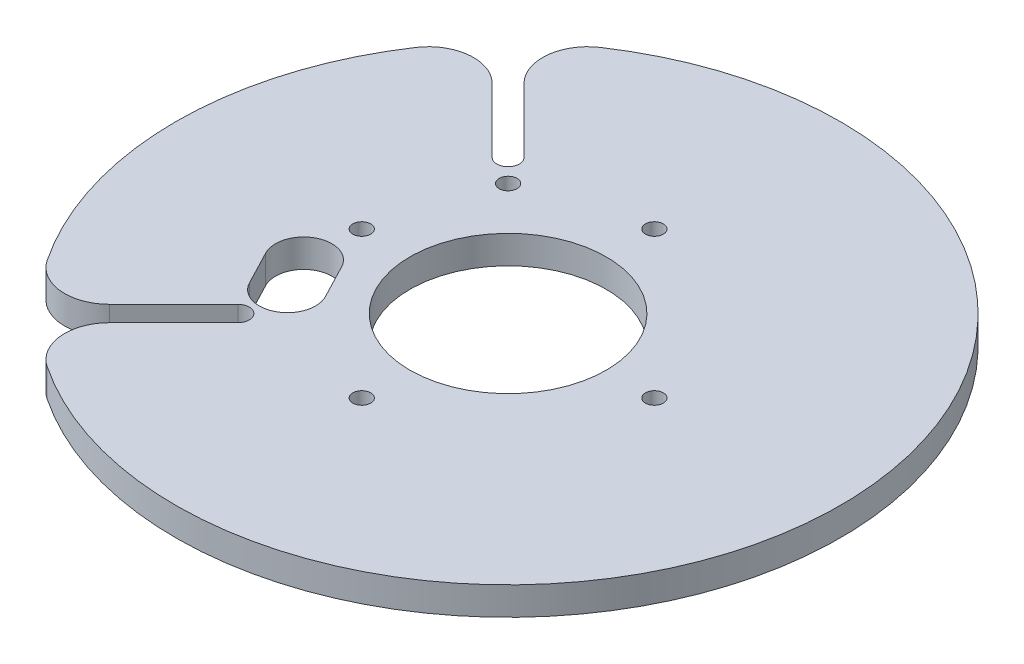
ISO-10303-21;
HEADER;
FILE_DESCRIPTION(('STEP AP214'),'2;1');
FILE_NAME('part.step','',(''),(''),'','','');
FILE_SCHEMA(('AUTOMOTIVE_DESIGN { 1 0 10303 214 1 1 1 1 }'));
ENDSEC;
DATA;
#1=APPLICATION_CONTEXT('core data for automotive mechanical design processes');
#2=APPLICATION_PROTOCOL_DEFINITION('international standard','automotive_design',2000,#1);
#3=PRODUCT_CONTEXT('',#1,'mechanical');
#4=PRODUCT('Part','Part','',(#3));
#5=PRODUCT_RELATED_PRODUCT_CATEGORY('part','',(#4));
#6=PRODUCT_DEFINITION_FORMATION('','',#4);
#7=PRODUCT_DEFINITION_CONTEXT('part definition',#1,'design');
#8=PRODUCT_DEFINITION('design','',#6,#7);
#9=PRODUCT_DEFINITION_SHAPE('','',#8);
#10=(LENGTH_UNIT() NAMED_UNIT(*) SI_UNIT(.MILLI.,.METRE.));
#11=(NAMED_UNIT(*) PLANE_ANGLE_UNIT() SI_UNIT($,.RADIAN.));
#12=(NAMED_UNIT(*) SI_UNIT($,.STERADIAN.) SOLID_ANGLE_UNIT());
#13=UNCERTAINTY_MEASURE_WITH_UNIT(LENGTH_MEASURE(1.E-05),#10,'distance_accuracy_value','');
#14=(GEOMETRIC_REPRESENTATION_CONTEXT(3) GLOBAL_UNCERTAINTY_ASSIGNED_CONTEXT((#13)) GLOBAL_UNIT_ASSIGNED_CONTEXT((#10,
#11,#12)) REPRESENTATION_CONTEXT('',''));
#15=CARTESIAN_POINT('',(0.,0.,0.));
#16=DIRECTION('',(0.,0.,1.));
#17=DIRECTION('',(1.,0.,0.));
#18=AXIS2_PLACEMENT_3D('',#15,#16,#17);
#19=CARTESIAN_POINT('',(0.,6.35,0.));
#20=DIRECTION('',(0.,-1.,0.));
#21=DIRECTION('',(0.,0.,-1.));
#22=AXIS2_PLACEMENT_3D('',#19,#20,#21);
#23=CYLINDRICAL_SURFACE('',#22,75.);
#24=CARTESIAN_POINT('',(0.,6.35,0.));
#25=DIRECTION('',(0.,1.,0.));
#26=DIRECTION('',(0.,0.,1.));
#27=AXIS2_PLACEMENT_3D('',#24,#25,#26);
#28=CIRCLE('',#27,75.);
#29=CARTESIAN_POINT('',(-41.6183838096096,6.35,62.3931897651982));
#30=VERTEX_POINT('',#29);
#31=CARTESIAN_POINT('',(-41.6183838096095,6.35,-62.3931897651982));
#32=VERTEX_POINT('',#31);
#33=EDGE_CURVE('E270',#30,#32,#28,.T.);
#34=ORIENTED_EDGE('',*,*,#33,.F.);
#35=DIRECTION('',(0.,-1.,0.));
#36=VECTOR('',#35,1.);
#37=CARTESIAN_POINT('',(-41.6183838096096,6.35,62.3931897651982));
#38=LINE('',#37,#36);
#39=CARTESIAN_POINT('',(-41.6183838096096,0.,62.3931897651982));
#40=VERTEX_POINT('',#39);
#41=EDGE_CURVE('E279',#30,#40,#38,.T.);
#42=ORIENTED_EDGE('',*,*,#41,.T.);
#43=CARTESIAN_POINT('',(0.,0.,0.));
#44=DIRECTION('',(0.,1.,0.));
#45=DIRECTION('',(0.,0.,1.));
#46=AXIS2_PLACEMENT_3D('',#43,#44,#45);
#47=CIRCLE('',#46,75.);
#48=CARTESIAN_POINT('',(-41.6183838096095,0.,-62.3931897651982));
#49=VERTEX_POINT('',#48);
#50=EDGE_CURVE('E264',#40,#49,#47,.T.);
#51=ORIENTED_EDGE('',*,*,#50,.T.);
#52=DIRECTION('',(0.,-1.,0.));
#53=VECTOR('',#52,1.);
#54=CARTESIAN_POINT('',(-41.6183838096095,6.35,-62.3931897651982));
#55=LINE('',#54,#53);
#56=EDGE_CURVE('E276',#49,#32,#55,.F.);
#57=ORIENTED_EDGE('',*,*,#56,.T.);
#58=EDGE_LOOP('',(#34,#42,#51,#57));
#59=FACE_BOUND('',#58,.T.);
#60=ADVANCED_FACE('F35',(#59),#23,.T.);
#61=CARTESIAN_POINT('',(-62.3931897651982,0.,-41.6183838096095));
#62=VERTEX_POINT('',#61);
#63=CARTESIAN_POINT('',(-62.3931897651983,0.,41.6183838096094));
#64=VERTEX_POINT('',#63);
#65=EDGE_CURVE('E271',#62,#64,#47,.T.);
#66=ORIENTED_EDGE('',*,*,#65,.T.);
#67=DIRECTION('',(0.,-1.,0.));
#68=VECTOR('',#67,1.);
#69=CARTESIAN_POINT('',(-62.3931897651983,6.35,41.6183838096094));
#70=LINE('',#69,#68);
#71=CARTESIAN_POINT('',(-62.3931897651983,6.35,41.6183838096094));
#72=VERTEX_POINT('',#71);
#73=EDGE_CURVE('E302',#64,#72,#70,.F.);
#74=ORIENTED_EDGE('',*,*,#73,.T.);
#75=CARTESIAN_POINT('',(-62.3931897651982,6.35,-41.6183838096095));
#76=VERTEX_POINT('',#75);
#77=EDGE_CURVE('E267',#76,#72,#28,.T.);
#78=ORIENTED_EDGE('',*,*,#77,.F.);
#79=DIRECTION('',(0.,-1.,0.));
#80=VECTOR('',#79,1.);
#81=CARTESIAN_POINT('',(-62.3931897651982,6.35,-41.6183838096095));
#82=LINE('',#81,#80);
#83=EDGE_CURVE('E299',#76,#62,#82,.T.);
#84=ORIENTED_EDGE('',*,*,#83,.T.);
#85=EDGE_LOOP('',(#66,#74,#78,#84));
#86=FACE_BOUND('',#85,.T.);
#87=ADVANCED_FACE('F331',(#86),#23,.T.);
#88=CARTESIAN_POINT('',(0.,6.35,0.));
#89=DIRECTION('',(0.,1.,0.));
#90=DIRECTION('',(0.,0.,1.));
#91=AXIS2_PLACEMENT_3D('',#88,#89,#90);
#92=PLANE('',#91);
#93=CARTESIAN_POINT('',(-33.02,6.35,0.));
#94=DIRECTION('',(0.,1.,0.));
#95=DIRECTION('',(0.,0.,1.));
#96=AXIS2_PLACEMENT_3D('',#93,#94,#95);
#97=CIRCLE('',#96,2.0193);
#98=CARTESIAN_POINT('',(-33.02,6.35,2.0193));
#99=VERTEX_POINT('',#98);
#100=EDGE_CURVE('E203',#99,#99,#97,.T.);
#101=ORIENTED_EDGE('',*,*,#100,.F.);
#102=EDGE_LOOP('',(#101));
#103=FACE_BOUND('',#102,.T.);
#104=CARTESIAN_POINT('',(-33.5359357397664,6.35,12.5896679089743));
#105=DIRECTION('',(0.,1.,0.));
#106=DIRECTION('',(0.,0.,1.));
#107=AXIS2_PLACEMENT_3D('',#104,#105,#106);
#108=CIRCLE('',#107,6.35);
#109=CARTESIAN_POINT('',(-27.9034169490847,6.35,9.65756421493182));
#110=VERTEX_POINT('',#109);
#111=CARTESIAN_POINT('',(-39.1684545304481,6.35,15.5217716030168));
#112=VERTEX_POINT('',#111);
#113=EDGE_CURVE('E179',#110,#112,#108,.T.);
#114=ORIENTED_EDGE('',*,*,#113,.F.);
#115=DIRECTION('',(-0.461748613235036,0.,-0.887010833178221));
#116=VECTOR('',#115,1.);
#117=CARTESIAN_POINT('',(-27.9034169490847,6.35,9.65756421493182));
#118=LINE('',#117,#116);
#119=CARTESIAN_POINT('',(-23.9157559251869,6.35,17.3177897702589));
#120=VERTEX_POINT('',#119);
#121=EDGE_CURVE('E211',#120,#110,#118,.T.);
#122=ORIENTED_EDGE('',*,*,#121,.F.);
#123=CARTESIAN_POINT('',(-29.5482747158686,6.35,20.2498934643014));
#124=DIRECTION('',(0.,1.,0.));
#125=DIRECTION('',(0.,0.,1.));
#126=AXIS2_PLACEMENT_3D('',#123,#124,#125);
#127=CIRCLE('',#126,6.35);
#128=CARTESIAN_POINT('',(-35.1807935065504,6.35,23.1819971583439));
#129=VERTEX_POINT('',#128);
#130=EDGE_CURVE('E225',#129,#120,#127,.T.);
#131=ORIENTED_EDGE('',*,*,#130,.F.);
#132=DIRECTION('',(0.461748613235036,0.,0.887010833178221));
#133=VECTOR('',#132,1.);
#134=CARTESIAN_POINT('',(-39.1684545304481,6.35,15.5217716030168));
#135=LINE('',#134,#133);
#136=EDGE_CURVE('E222',#112,#129,#135,.T.);
#137=ORIENTED_EDGE('',*,*,#136,.F.);
#138=EDGE_LOOP('',(#114,#122,#131,#137));
#139=FACE_BOUND('',#138,.T.);
#140=DIRECTION('',(0.707106781186551,0.,-0.707106781186544));
#141=VECTOR('',#140,1.);
#142=CARTESIAN_POINT('',(-28.6839487757862,6.35,32.2760512242138));
#143=LINE('',#142,#141);
#144=CARTESIAN_POINT('',(-43.1646849797231,6.35,46.7567874281506));
#145=VERTEX_POINT('',#144);
#146=CARTESIAN_POINT('',(-28.6839487757862,6.35,32.2760512242138));
#147=VERTEX_POINT('',#146);
#148=EDGE_CURVE('E171',#145,#147,#143,.T.);
#149=ORIENTED_EDGE('',*,*,#148,.F.);
#150=CARTESIAN_POINT('',(-35.9804800828678,6.35,53.940992325006));
#151=DIRECTION('',(0.,1.,0.));
#152=DIRECTION('',(0.,0.,1.));
#153=AXIS2_PLACEMENT_3D('',#150,#151,#152);
#154=CIRCLE('',#153,10.16);
#155=EDGE_CURVE('E297',#145,#30,#154,.T.);
#156=ORIENTED_EDGE('',*,*,#155,.T.);
#157=ORIENTED_EDGE('',*,*,#33,.T.);
#158=CARTESIAN_POINT('',(-35.9804800828677,6.35,-53.940992325006));
#159=DIRECTION('',(0.,1.,0.));
#160=DIRECTION('',(0.,0.,1.));
#161=AXIS2_PLACEMENT_3D('',#158,#159,#160);
#162=CIRCLE('',#161,10.16);
#163=CARTESIAN_POINT('',(-43.164684979723,6.35,-46.7567874281507));
#164=VERTEX_POINT('',#163);
#165=EDGE_CURVE('E294',#32,#164,#162,.T.);
#166=ORIENTED_EDGE('',*,*,#165,.T.);
#167=DIRECTION('',(-0.707106781186547,0.,-0.707106781186548));
#168=VECTOR('',#167,1.);
#169=CARTESIAN_POINT('',(-28.6839487757862,6.35,-32.2760512242138));
#170=LINE('',#169,#168);
#171=CARTESIAN_POINT('',(-28.6839487757862,6.35,-32.2760512242138));
#172=VERTEX_POINT('',#171);
#173=EDGE_CURVE('E192',#172,#164,#170,.T.);
#174=ORIENTED_EDGE('',*,*,#173,.F.);
#175=CARTESIAN_POINT('',(-30.48,6.35,-30.48));
#176=DIRECTION('',(0.,1.,0.));
#177=DIRECTION('',(0.,0.,1.));
#178=AXIS2_PLACEMENT_3D('',#175,#176,#177);
#179=CIRCLE('',#178,2.54);
#180=CARTESIAN_POINT('',(-32.2760512242138,6.35,-28.6839487757862));
#181=VERTEX_POINT('',#180);
#182=EDGE_CURVE('E189',#181,#172,#179,.T.);
#183=ORIENTED_EDGE('',*,*,#182,.F.);
#184=DIRECTION('',(0.707106781186548,0.,0.707106781186547));
#185=VECTOR('',#184,1.);
#186=CARTESIAN_POINT('',(-32.2760512242138,6.35,-28.6839487757862));
#187=LINE('',#186,#185);
#188=CARTESIAN_POINT('',(-46.7567874281507,6.35,-43.164684979723));
#189=VERTEX_POINT('',#188);
#190=EDGE_CURVE('E185',#189,#181,#187,.T.);
#191=ORIENTED_EDGE('',*,*,#190,.F.);
#192=CARTESIAN_POINT('',(-53.940992325006,6.35,-35.9804800828677));
#193=DIRECTION('',(0.,1.,0.));
#194=DIRECTION('',(0.,0.,1.));
#195=AXIS2_PLACEMENT_3D('',#192,#193,#194);
#196=CIRCLE('',#195,10.16);
#197=EDGE_CURVE('E292',#189,#76,#196,.T.);
#198=ORIENTED_EDGE('',*,*,#197,.T.);
#199=ORIENTED_EDGE('',*,*,#77,.T.);
#200=CARTESIAN_POINT('',(-53.9409923250061,6.35,35.9804800828676));
#201=DIRECTION('',(0.,1.,0.));
#202=DIRECTION('',(0.,0.,1.));
#203=AXIS2_PLACEMENT_3D('',#200,#201,#202);
#204=CIRCLE('',#203,10.16);
#205=CARTESIAN_POINT('',(-46.7567874281508,6.35,43.164684979723));
#206=VERTEX_POINT('',#205);
#207=EDGE_CURVE('E50',#72,#206,#204,.T.);
#208=ORIENTED_EDGE('',*,*,#207,.T.);
#209=DIRECTION('',(-0.707106781186551,0.,0.707106781186544));
#210=VECTOR('',#209,1.);
#211=CARTESIAN_POINT('',(-32.2760512242138,6.35,28.6839487757862));
#212=LINE('',#211,#210);
#213=CARTESIAN_POINT('',(-32.2760512242138,6.35,28.6839487757862));
#214=VERTEX_POINT('',#213);
#215=EDGE_CURVE('E173',#214,#206,#212,.T.);
#216=ORIENTED_EDGE('',*,*,#215,.F.);
#217=CARTESIAN_POINT('',(-30.48,6.35,30.48));
#218=DIRECTION('',(0.,1.,0.));
#219=DIRECTION('',(0.,0.,1.));
#220=AXIS2_PLACEMENT_3D('',#217,#218,#219);
#221=CIRCLE('',#220,2.54);
#222=EDGE_CURVE('E155',#147,#214,#221,.T.);
#223=ORIENTED_EDGE('',*,*,#222,.F.);
#224=EDGE_LOOP('',(#149,#156,#157,#166,#174,#183,#191,#198,#199,#208,#216,#223));
#225=FACE_BOUND('',#224,.T.);
#226=CARTESIAN_POINT('',(0.,6.35,33.02));
#227=DIRECTION('',(0.,1.,0.));
#228=DIRECTION('',(0.,0.,1.));
#229=AXIS2_PLACEMENT_3D('',#226,#227,#228);
#230=CIRCLE('',#229,2.0193);
#231=CARTESIAN_POINT('',(0.,6.35,35.0393));
#232=VERTEX_POINT('',#231);
#233=EDGE_CURVE('E202',#232,#232,#230,.T.);
#234=ORIENTED_EDGE('',*,*,#233,.F.);
#235=EDGE_LOOP('',(#234));
#236=FACE_BOUND('',#235,.T.);
#237=CARTESIAN_POINT('',(33.02,6.35,0.));
#238=DIRECTION('',(0.,1.,0.));
#239=DIRECTION('',(0.,0.,1.));
#240=AXIS2_PLACEMENT_3D('',#237,#238,#239);
#241=CIRCLE('',#240,2.0193);
#242=CARTESIAN_POINT('',(33.02,6.35,2.0193));
#243=VERTEX_POINT('',#242);
#244=EDGE_CURVE('E253',#243,#243,#241,.T.);
#245=ORIENTED_EDGE('',*,*,#244,.F.);
#246=EDGE_LOOP('',(#245));
#247=FACE_BOUND('',#246,.T.);
#248=CARTESIAN_POINT('',(0.,6.35,-33.02));
#249=DIRECTION('',(0.,1.,0.));
#250=DIRECTION('',(0.,0.,1.));
#251=AXIS2_PLACEMENT_3D('',#248,#249,#250);
#252=CIRCLE('',#251,2.0193);
#253=CARTESIAN_POINT('',(0.,6.35,-31.0007));
#254=VERTEX_POINT('',#253);
#255=EDGE_CURVE('E247',#254,#254,#252,.T.);
#256=ORIENTED_EDGE('',*,*,#255,.F.);
#257=EDGE_LOOP('',(#256));
#258=FACE_BOUND('',#257,.T.);
#259=CARTESIAN_POINT('',(-25.4,6.35,-25.4));
#260=DIRECTION('',(0.,1.,0.));
#261=DIRECTION('',(0.,0.,1.));
#262=AXIS2_PLACEMENT_3D('',#259,#260,#261);
#263=CIRCLE('',#262,2.0193);
#264=CARTESIAN_POINT('',(-25.4,6.35,-23.3807));
#265=VERTEX_POINT('',#264);
#266=EDGE_CURVE('E241',#265,#265,#263,.T.);
#267=ORIENTED_EDGE('',*,*,#266,.F.);
#268=EDGE_LOOP('',(#267));
#269=FACE_BOUND('',#268,.T.);
#270=CARTESIAN_POINT('',(0.,6.35,0.));
#271=DIRECTION('',(0.,1.,0.));
#272=DIRECTION('',(0.,0.,1.));
#273=AXIS2_PLACEMENT_3D('',#270,#271,#272);
#274=CIRCLE('',#273,22.1615);
#275=CARTESIAN_POINT('',(0.,6.35,22.1615));
#276=VERTEX_POINT('',#275);
#277=EDGE_CURVE('E240',#276,#276,#274,.T.);
#278=ORIENTED_EDGE('',*,*,#277,.F.);
#279=EDGE_LOOP('',(#278));
#280=FACE_BOUND('',#279,.T.);
#281=ADVANCED_FACE('F320',(#103,#139,#225,#236,#247,#258,#269,#280),#92,.T.);
#282=CARTESIAN_POINT('',(0.,0.,0.));
#283=DIRECTION('',(0.,1.,0.));
#284=DIRECTION('',(0.,0.,1.));
#285=AXIS2_PLACEMENT_3D('',#282,#283,#284);
#286=PLANE('',#285);
#287=CARTESIAN_POINT('',(-33.02,0.,0.));
#288=DIRECTION('',(0.,1.,0.));
#289=DIRECTION('',(0.,0.,1.));
#290=AXIS2_PLACEMENT_3D('',#287,#288,#289);
#291=CIRCLE('',#290,2.0193);
#292=CARTESIAN_POINT('',(-33.02,0.,2.0193));
#293=VERTEX_POINT('',#292);
#294=EDGE_CURVE('E199',#293,#293,#291,.T.);
#295=ORIENTED_EDGE('',*,*,#294,.T.);
#296=EDGE_LOOP('',(#295));
#297=FACE_BOUND('',#296,.T.);
#298=DIRECTION('',(-0.461748613235036,0.,-0.887010833178221));
#299=VECTOR('',#298,1.);
#300=CARTESIAN_POINT('',(-27.9034169490847,0.,9.65756421493182));
#301=LINE('',#300,#299);
#302=CARTESIAN_POINT('',(-23.9157559251869,0.,17.3177897702589));
#303=VERTEX_POINT('',#302);
#304=CARTESIAN_POINT('',(-27.9034169490847,0.,9.65756421493182));
#305=VERTEX_POINT('',#304);
#306=EDGE_CURVE('E217',#303,#305,#301,.T.);
#307=ORIENTED_EDGE('',*,*,#306,.T.);
#308=CARTESIAN_POINT('',(-33.5359357397664,0.,12.5896679089743));
#309=DIRECTION('',(0.,1.,0.));
#310=DIRECTION('',(0.,0.,1.));
#311=AXIS2_PLACEMENT_3D('',#308,#309,#310);
#312=CIRCLE('',#311,6.35);
#313=CARTESIAN_POINT('',(-39.1684545304481,0.,15.5217716030168));
#314=VERTEX_POINT('',#313);
#315=EDGE_CURVE('E207',#305,#314,#312,.T.);
#316=ORIENTED_EDGE('',*,*,#315,.T.);
#317=DIRECTION('',(0.461748613235036,0.,0.887010833178221));
#318=VECTOR('',#317,1.);
#319=CARTESIAN_POINT('',(-39.1684545304481,0.,15.5217716030168));
#320=LINE('',#319,#318);
#321=CARTESIAN_POINT('',(-35.1807935065504,0.,23.1819971583439));
#322=VERTEX_POINT('',#321);
#323=EDGE_CURVE('E210',#314,#322,#320,.T.);
#324=ORIENTED_EDGE('',*,*,#323,.T.);
#325=CARTESIAN_POINT('',(-29.5482747158686,0.,20.2498934643014));
#326=DIRECTION('',(0.,1.,0.));
#327=DIRECTION('',(0.,0.,1.));
#328=AXIS2_PLACEMENT_3D('',#325,#326,#327);
#329=CIRCLE('',#328,6.35);
#330=EDGE_CURVE('E214',#322,#303,#329,.T.);
#331=ORIENTED_EDGE('',*,*,#330,.T.);
#332=EDGE_LOOP('',(#307,#316,#324,#331));
#333=FACE_BOUND('',#332,.T.);
#334=CARTESIAN_POINT('',(0.,0.,33.02));
#335=DIRECTION('',(0.,1.,0.));
#336=DIRECTION('',(0.,0.,1.));
#337=AXIS2_PLACEMENT_3D('',#334,#335,#336);
#338=CIRCLE('',#337,2.0193);
#339=CARTESIAN_POINT('',(0.,0.,35.0393));
#340=VERTEX_POINT('',#339);
#341=EDGE_CURVE('E256',#340,#340,#338,.T.);
#342=ORIENTED_EDGE('',*,*,#341,.T.);
#343=EDGE_LOOP('',(#342));
#344=FACE_BOUND('',#343,.T.);
#345=CARTESIAN_POINT('',(33.02,0.,0.));
#346=DIRECTION('',(0.,1.,0.));
#347=DIRECTION('',(0.,0.,1.));
#348=AXIS2_PLACEMENT_3D('',#345,#346,#347);
#349=CIRCLE('',#348,2.0193);
#350=CARTESIAN_POINT('',(33.02,0.,2.0193));
#351=VERTEX_POINT('',#350);
#352=EDGE_CURVE('E250',#351,#351,#349,.T.);
#353=ORIENTED_EDGE('',*,*,#352,.T.);
#354=EDGE_LOOP('',(#353));
#355=FACE_BOUND('',#354,.T.);
#356=CARTESIAN_POINT('',(0.,0.,-33.02));
#357=DIRECTION('',(0.,1.,0.));
#358=DIRECTION('',(0.,0.,1.));
#359=AXIS2_PLACEMENT_3D('',#356,#357,#358);
#360=CIRCLE('',#359,2.0193);
#361=CARTESIAN_POINT('',(0.,0.,-31.0007));
#362=VERTEX_POINT('',#361);
#363=EDGE_CURVE('E244',#362,#362,#360,.T.);
#364=ORIENTED_EDGE('',*,*,#363,.T.);
#365=EDGE_LOOP('',(#364));
#366=FACE_BOUND('',#365,.T.);
#367=CARTESIAN_POINT('',(-25.4,0.,-25.4));
#368=DIRECTION('',(0.,1.,0.));
#369=DIRECTION('',(0.,0.,1.));
#370=AXIS2_PLACEMENT_3D('',#367,#368,#369);
#371=CIRCLE('',#370,2.0193);
#372=CARTESIAN_POINT('',(-25.4,0.,-23.3807));
#373=VERTEX_POINT('',#372);
#374=EDGE_CURVE('E237',#373,#373,#371,.T.);
#375=ORIENTED_EDGE('',*,*,#374,.T.);
#376=EDGE_LOOP('',(#375));
#377=FACE_BOUND('',#376,.T.);
#378=CARTESIAN_POINT('',(0.,0.,0.));
#379=DIRECTION('',(0.,1.,0.));
#380=DIRECTION('',(0.,0.,1.));
#381=AXIS2_PLACEMENT_3D('',#378,#379,#380);
#382=CIRCLE('',#381,22.1615);
#383=CARTESIAN_POINT('',(0.,0.,22.1615));
#384=VERTEX_POINT('',#383);
#385=EDGE_CURVE('E261',#384,#384,#382,.T.);
#386=ORIENTED_EDGE('',*,*,#385,.T.);
#387=EDGE_LOOP('',(#386));
#388=FACE_BOUND('',#387,.T.);
#389=ORIENTED_EDGE('',*,*,#50,.F.);
#390=CARTESIAN_POINT('',(-35.9804800828678,0.,53.940992325006));
#391=DIRECTION('',(0.,1.,0.));
#392=DIRECTION('',(0.,0.,1.));
#393=AXIS2_PLACEMENT_3D('',#390,#391,#392);
#394=CIRCLE('',#393,10.16);
#395=CARTESIAN_POINT('',(-43.1646849797231,0.,46.7567874281506));
#396=VERTEX_POINT('',#395);
#397=EDGE_CURVE('E288',#40,#396,#394,.F.);
#398=ORIENTED_EDGE('',*,*,#397,.T.);
#399=DIRECTION('',(0.707106781186551,0.,-0.707106781186544));
#400=VECTOR('',#399,1.);
#401=CARTESIAN_POINT('',(1.79605122421398,0.,1.796051224214));
#402=LINE('',#401,#400);
#403=CARTESIAN_POINT('',(-28.6839487757862,0.,32.2760512242138));
#404=VERTEX_POINT('',#403);
#405=EDGE_CURVE('E169',#396,#404,#402,.T.);
#406=ORIENTED_EDGE('',*,*,#405,.T.);
#407=CARTESIAN_POINT('',(-30.48,0.,30.48));
#408=DIRECTION('',(0.,1.,0.));
#409=DIRECTION('',(0.,0.,1.));
#410=AXIS2_PLACEMENT_3D('',#407,#408,#409);
#411=CIRCLE('',#410,2.54);
#412=CARTESIAN_POINT('',(-32.2760512242138,0.,28.6839487757862));
#413=VERTEX_POINT('',#412);
#414=EDGE_CURVE('E153',#404,#413,#411,.T.);
#415=ORIENTED_EDGE('',*,*,#414,.T.);
#416=DIRECTION('',(-0.707106781186551,0.,0.707106781186544));
#417=VECTOR('',#416,1.);
#418=CARTESIAN_POINT('',(-32.2760512242138,0.,28.6839487757862));
#419=LINE('',#418,#417);
#420=CARTESIAN_POINT('',(-46.7567874281508,0.,43.164684979723));
#421=VERTEX_POINT('',#420);
#422=EDGE_CURVE('E158',#413,#421,#419,.T.);
#423=ORIENTED_EDGE('',*,*,#422,.T.);
#424=CARTESIAN_POINT('',(-53.9409923250061,0.,35.9804800828676));
#425=DIRECTION('',(0.,1.,0.));
#426=DIRECTION('',(0.,0.,1.));
#427=AXIS2_PLACEMENT_3D('',#424,#425,#426);
#428=CIRCLE('',#427,10.16);
#429=EDGE_CURVE('E286',#421,#64,#428,.F.);
#430=ORIENTED_EDGE('',*,*,#429,.T.);
#431=ORIENTED_EDGE('',*,*,#65,.F.);
#432=CARTESIAN_POINT('',(-53.940992325006,0.,-35.9804800828677));
#433=DIRECTION('',(0.,1.,0.));
#434=DIRECTION('',(0.,0.,1.));
#435=AXIS2_PLACEMENT_3D('',#432,#433,#434);
#436=CIRCLE('',#435,10.16);
#437=CARTESIAN_POINT('',(-46.7567874281507,0.,-43.164684979723));
#438=VERTEX_POINT('',#437);
#439=EDGE_CURVE('E282',#62,#438,#436,.F.);
#440=ORIENTED_EDGE('',*,*,#439,.T.);
#441=DIRECTION('',(0.707106781186548,0.,0.707106781186547));
#442=VECTOR('',#441,1.);
#443=CARTESIAN_POINT('',(-1.79605122421383,0.,1.79605122421383));
#444=LINE('',#443,#442);
#445=CARTESIAN_POINT('',(-32.2760512242138,0.,-28.6839487757862));
#446=VERTEX_POINT('',#445);
#447=EDGE_CURVE('E269',#438,#446,#444,.T.);
#448=ORIENTED_EDGE('',*,*,#447,.T.);
#449=CARTESIAN_POINT('',(-30.48,0.,-30.48));
#450=DIRECTION('',(0.,1.,0.));
#451=DIRECTION('',(0.,0.,1.));
#452=AXIS2_PLACEMENT_3D('',#449,#450,#451);
#453=CIRCLE('',#452,2.54);
#454=CARTESIAN_POINT('',(-28.6839487757862,0.,-32.2760512242138));
#455=VERTEX_POINT('',#454);
#456=EDGE_CURVE('E181',#446,#455,#453,.T.);
#457=ORIENTED_EDGE('',*,*,#456,.T.);
#458=DIRECTION('',(-0.707106781186547,0.,-0.707106781186548));
#459=VECTOR('',#458,1.);
#460=CARTESIAN_POINT('',(-28.6839487757862,0.,-32.2760512242138));
#461=LINE('',#460,#459);
#462=CARTESIAN_POINT('',(-43.164684979723,0.,-46.7567874281507));
#463=VERTEX_POINT('',#462);
#464=EDGE_CURVE('E184',#455,#463,#461,.T.);
#465=ORIENTED_EDGE('',*,*,#464,.T.);
#466=CARTESIAN_POINT('',(-35.9804800828677,0.,-53.940992325006));
#467=DIRECTION('',(0.,1.,0.));
#468=DIRECTION('',(0.,0.,1.));
#469=AXIS2_PLACEMENT_3D('',#466,#467,#468);
#470=CIRCLE('',#469,10.16);
#471=EDGE_CURVE('E284',#463,#49,#470,.F.);
#472=ORIENTED_EDGE('',*,*,#471,.T.);
#473=EDGE_LOOP('',(#389,#398,#406,#415,#423,#430,#431,#440,#448,#457,#465,#472));
#474=FACE_BOUND('',#473,.T.);
#475=ADVANCED_FACE('F167',(#297,#333,#344,#355,#366,#377,#388,#474),#286,.F.);
#476=CARTESIAN_POINT('',(0.,0.,0.));
#477=DIRECTION('',(0.,1.,0.));
#478=DIRECTION('',(0.,0.,1.));
#479=AXIS2_PLACEMENT_3D('',#476,#477,#478);
#480=CYLINDRICAL_SURFACE('',#479,22.1615);
#481=ORIENTED_EDGE('',*,*,#385,.F.);
#482=EDGE_LOOP('',(#481));
#483=FACE_BOUND('',#482,.T.);
#484=ORIENTED_EDGE('',*,*,#277,.T.);
#485=EDGE_LOOP('',(#484));
#486=FACE_BOUND('',#485,.T.);
#487=ADVANCED_FACE('F433',(#483,#486),#480,.F.);
#488=CARTESIAN_POINT('',(-25.4,0.,-25.4));
#489=DIRECTION('',(0.,1.,0.));
#490=DIRECTION('',(0.,0.,1.));
#491=AXIS2_PLACEMENT_3D('',#488,#489,#490);
#492=CYLINDRICAL_SURFACE('',#491,2.0193);
#493=ORIENTED_EDGE('',*,*,#374,.F.);
#494=EDGE_LOOP('',(#493));
#495=FACE_BOUND('',#494,.T.);
#496=ORIENTED_EDGE('',*,*,#266,.T.);
#497=EDGE_LOOP('',(#496));
#498=FACE_BOUND('',#497,.T.);
#499=ADVANCED_FACE('F535',(#495,#498),#492,.F.);
#500=CARTESIAN_POINT('',(0.,0.,-33.02));
#501=DIRECTION('',(0.,1.,0.));
#502=DIRECTION('',(0.,0.,1.));
#503=AXIS2_PLACEMENT_3D('',#500,#501,#502);
#504=CYLINDRICAL_SURFACE('',#503,2.0193);
#505=ORIENTED_EDGE('',*,*,#363,.F.);
#506=EDGE_LOOP('',(#505));
#507=FACE_BOUND('',#506,.T.);
#508=ORIENTED_EDGE('',*,*,#255,.T.);
#509=EDGE_LOOP('',(#508));
#510=FACE_BOUND('',#509,.T.);
#511=ADVANCED_FACE('F525',(#507,#510),#504,.F.);
#512=CARTESIAN_POINT('',(33.02,0.,0.));
#513=DIRECTION('',(0.,1.,0.));
#514=DIRECTION('',(0.,0.,1.));
#515=AXIS2_PLACEMENT_3D('',#512,#513,#514);
#516=CYLINDRICAL_SURFACE('',#515,2.0193);
#517=ORIENTED_EDGE('',*,*,#352,.F.);
#518=EDGE_LOOP('',(#517));
#519=FACE_BOUND('',#518,.T.);
#520=ORIENTED_EDGE('',*,*,#244,.T.);
#521=EDGE_LOOP('',(#520));
#522=FACE_BOUND('',#521,.T.);
#523=ADVANCED_FACE('F515',(#519,#522),#516,.F.);
#524=CARTESIAN_POINT('',(0.,0.,33.02));
#525=DIRECTION('',(0.,1.,0.));
#526=DIRECTION('',(0.,0.,1.));
#527=AXIS2_PLACEMENT_3D('',#524,#525,#526);
#528=CYLINDRICAL_SURFACE('',#527,2.0193);
#529=ORIENTED_EDGE('',*,*,#341,.F.);
#530=EDGE_LOOP('',(#529));
#531=FACE_BOUND('',#530,.T.);
#532=ORIENTED_EDGE('',*,*,#233,.T.);
#533=EDGE_LOOP('',(#532));
#534=FACE_BOUND('',#533,.T.);
#535=ADVANCED_FACE('F422',(#531,#534),#528,.F.);
#536=CARTESIAN_POINT('',(-32.2760512242138,0.,-28.6839487757862));
#537=DIRECTION('',(-0.707106781186547,0.,0.707106781186548));
#538=DIRECTION('',(0.707106781186548,0.,0.707106781186547));
#539=AXIS2_PLACEMENT_3D('',#536,#537,#538);
#540=PLANE('',#539);
#541=ORIENTED_EDGE('',*,*,#447,.F.);
#542=DIRECTION('',(0.,-1.,0.));
#543=VECTOR('',#542,1.);
#544=CARTESIAN_POINT('',(-46.7567874281507,0.,-43.164684979723));
#545=LINE('',#544,#543);
#546=EDGE_CURVE('E11',#438,#189,#545,.F.);
#547=ORIENTED_EDGE('',*,*,#546,.T.);
#548=ORIENTED_EDGE('',*,*,#190,.T.);
#549=DIRECTION('',(0.,1.,0.));
#550=VECTOR('',#549,1.);
#551=CARTESIAN_POINT('',(-32.2760512242138,0.,-28.6839487757862));
#552=LINE('',#551,#550);
#553=EDGE_CURVE('E177',#446,#181,#552,.T.);
#554=ORIENTED_EDGE('',*,*,#553,.F.);
#555=EDGE_LOOP('',(#541,#547,#548,#554));
#556=FACE_BOUND('',#555,.T.);
#557=ADVANCED_FACE('F340',(#556),#540,.F.);
#558=CARTESIAN_POINT('',(-28.6839487757862,0.,-32.2760512242138));
#559=DIRECTION('',(0.707106781186548,0.,-0.707106781186547));
#560=DIRECTION('',(-0.707106781186547,0.,-0.707106781186548));
#561=AXIS2_PLACEMENT_3D('',#558,#559,#560);
#562=PLANE('',#561);
#563=ORIENTED_EDGE('',*,*,#173,.T.);
#564=DIRECTION('',(0.,-1.,0.));
#565=VECTOR('',#564,1.);
#566=CARTESIAN_POINT('',(-43.164684979723,0.,-46.7567874281507));
#567=LINE('',#566,#565);
#568=EDGE_CURVE('E43',#164,#463,#567,.T.);
#569=ORIENTED_EDGE('',*,*,#568,.T.);
#570=ORIENTED_EDGE('',*,*,#464,.F.);
#571=DIRECTION('',(0.,1.,0.));
#572=VECTOR('',#571,1.);
#573=CARTESIAN_POINT('',(-28.6839487757862,0.,-32.2760512242138));
#574=LINE('',#573,#572);
#575=EDGE_CURVE('E188',#455,#172,#574,.T.);
#576=ORIENTED_EDGE('',*,*,#575,.T.);
#577=EDGE_LOOP('',(#563,#569,#570,#576));
#578=FACE_BOUND('',#577,.T.);
#579=ADVANCED_FACE('F307',(#578),#562,.F.);
#580=CARTESIAN_POINT('',(-30.48,0.,-30.48));
#581=DIRECTION('',(0.,1.,0.));
#582=DIRECTION('',(0.,0.,1.));
#583=AXIS2_PLACEMENT_3D('',#580,#581,#582);
#584=CYLINDRICAL_SURFACE('',#583,2.54);
#585=ORIENTED_EDGE('',*,*,#182,.T.);
#586=ORIENTED_EDGE('',*,*,#575,.F.);
#587=ORIENTED_EDGE('',*,*,#456,.F.);
#588=ORIENTED_EDGE('',*,*,#553,.T.);
#589=EDGE_LOOP('',(#585,#586,#587,#588));
#590=FACE_BOUND('',#589,.T.);
#591=ADVANCED_FACE('F344',(#590),#584,.F.);
#592=CARTESIAN_POINT('',(-28.6839487757862,0.,32.2760512242138));
#593=DIRECTION('',(0.707106781186544,0.,0.707106781186551));
#594=DIRECTION('',(0.707106781186551,0.,-0.707106781186544));
#595=AXIS2_PLACEMENT_3D('',#592,#593,#594);
#596=PLANE('',#595);
#597=ORIENTED_EDGE('',*,*,#405,.F.);
#598=DIRECTION('',(0.,-1.,0.));
#599=VECTOR('',#598,1.);
#600=CARTESIAN_POINT('',(-43.1646849797231,0.,46.7567874281506));
#601=LINE('',#600,#599);
#602=EDGE_CURVE('E290',#396,#145,#601,.F.);
#603=ORIENTED_EDGE('',*,*,#602,.T.);
#604=ORIENTED_EDGE('',*,*,#148,.T.);
#605=DIRECTION('',(0.,1.,0.));
#606=VECTOR('',#605,1.);
#607=CARTESIAN_POINT('',(-28.6839487757862,0.,32.2760512242138));
#608=LINE('',#607,#606);
#609=EDGE_CURVE('E157',#404,#147,#608,.T.);
#610=ORIENTED_EDGE('',*,*,#609,.F.);
#611=EDGE_LOOP('',(#597,#603,#604,#610));
#612=FACE_BOUND('',#611,.T.);
#613=ADVANCED_FACE('F327',(#612),#596,.F.);
#614=CARTESIAN_POINT('',(-32.2760512242138,0.,28.6839487757862));
#615=DIRECTION('',(-0.707106781186544,0.,-0.707106781186551));
#616=DIRECTION('',(-0.707106781186551,0.,0.707106781186544));
#617=AXIS2_PLACEMENT_3D('',#614,#615,#616);
#618=PLANE('',#617);
#619=ORIENTED_EDGE('',*,*,#215,.T.);
#620=DIRECTION('',(0.,-1.,0.));
#621=VECTOR('',#620,1.);
#622=CARTESIAN_POINT('',(-46.7567874281508,0.,43.164684979723));
#623=LINE('',#622,#621);
#624=EDGE_CURVE('E162',#206,#421,#623,.T.);
#625=ORIENTED_EDGE('',*,*,#624,.T.);
#626=ORIENTED_EDGE('',*,*,#422,.F.);
#627=DIRECTION('',(0.,1.,0.));
#628=VECTOR('',#627,1.);
#629=CARTESIAN_POINT('',(-32.2760512242138,0.,28.6839487757862));
#630=LINE('',#629,#628);
#631=EDGE_CURVE('E148',#413,#214,#630,.T.);
#632=ORIENTED_EDGE('',*,*,#631,.T.);
#633=EDGE_LOOP('',(#619,#625,#626,#632));
#634=FACE_BOUND('',#633,.T.);
#635=ADVANCED_FACE('F161',(#634),#618,.F.);
#636=CARTESIAN_POINT('',(-30.48,0.,30.48));
#637=DIRECTION('',(0.,1.,0.));
#638=DIRECTION('',(0.,0.,1.));
#639=AXIS2_PLACEMENT_3D('',#636,#637,#638);
#640=CYLINDRICAL_SURFACE('',#639,2.54);
#641=ORIENTED_EDGE('',*,*,#222,.T.);
#642=ORIENTED_EDGE('',*,*,#631,.F.);
#643=ORIENTED_EDGE('',*,*,#414,.F.);
#644=ORIENTED_EDGE('',*,*,#609,.T.);
#645=EDGE_LOOP('',(#641,#642,#643,#644));
#646=FACE_BOUND('',#645,.T.);
#647=ADVANCED_FACE('F150',(#646),#640,.F.);
#648=CARTESIAN_POINT('',(-33.5359357397664,0.,12.5896679089743));
#649=DIRECTION('',(0.,1.,0.));
#650=DIRECTION('',(0.,0.,1.));
#651=AXIS2_PLACEMENT_3D('',#648,#649,#650);
#652=CYLINDRICAL_SURFACE('',#651,6.35);
#653=ORIENTED_EDGE('',*,*,#113,.T.);
#654=DIRECTION('',(0.,1.,0.));
#655=VECTOR('',#654,1.);
#656=CARTESIAN_POINT('',(-39.1684545304481,0.,15.5217716030168));
#657=LINE('',#656,#655);
#658=EDGE_CURVE('E220',#314,#112,#657,.T.);
#659=ORIENTED_EDGE('',*,*,#658,.F.);
#660=ORIENTED_EDGE('',*,*,#315,.F.);
#661=DIRECTION('',(0.,1.,0.));
#662=VECTOR('',#661,1.);
#663=CARTESIAN_POINT('',(-27.9034169490847,0.,9.65756421493182));
#664=LINE('',#663,#662);
#665=EDGE_CURVE('E206',#305,#110,#664,.T.);
#666=ORIENTED_EDGE('',*,*,#665,.T.);
#667=EDGE_LOOP('',(#653,#659,#660,#666));
#668=FACE_BOUND('',#667,.T.);
#669=ADVANCED_FACE('F489',(#668),#652,.F.);
#670=CARTESIAN_POINT('',(-27.9034169490847,0.,9.65756421493182));
#671=DIRECTION('',(0.887010833178221,0.,-0.461748613235036));
#672=DIRECTION('',(-0.461748613235036,0.,-0.887010833178221));
#673=AXIS2_PLACEMENT_3D('',#670,#671,#672);
#674=PLANE('',#673);
#675=ORIENTED_EDGE('',*,*,#121,.T.);
#676=ORIENTED_EDGE('',*,*,#665,.F.);
#677=ORIENTED_EDGE('',*,*,#306,.F.);
#678=DIRECTION('',(0.,1.,0.));
#679=VECTOR('',#678,1.);
#680=CARTESIAN_POINT('',(-23.9157559251869,0.,17.3177897702589));
#681=LINE('',#680,#679);
#682=EDGE_CURVE('E231',#303,#120,#681,.T.);
#683=ORIENTED_EDGE('',*,*,#682,.T.);
#684=EDGE_LOOP('',(#675,#676,#677,#683));
#685=FACE_BOUND('',#684,.T.);
#686=ADVANCED_FACE('F479',(#685),#674,.F.);
#687=CARTESIAN_POINT('',(-29.5482747158686,0.,20.2498934643014));
#688=DIRECTION('',(0.,1.,0.));
#689=DIRECTION('',(0.,0.,1.));
#690=AXIS2_PLACEMENT_3D('',#687,#688,#689);
#691=CYLINDRICAL_SURFACE('',#690,6.35);
#692=ORIENTED_EDGE('',*,*,#130,.T.);
#693=ORIENTED_EDGE('',*,*,#682,.F.);
#694=ORIENTED_EDGE('',*,*,#330,.F.);
#695=DIRECTION('',(0.,1.,0.));
#696=VECTOR('',#695,1.);
#697=CARTESIAN_POINT('',(-35.1807935065504,0.,23.1819971583439));
#698=LINE('',#697,#696);
#699=EDGE_CURVE('E233',#322,#129,#698,.T.);
#700=ORIENTED_EDGE('',*,*,#699,.T.);
#701=EDGE_LOOP('',(#692,#693,#694,#700));
#702=FACE_BOUND('',#701,.T.);
#703=ADVANCED_FACE('F469',(#702),#691,.F.);
#704=CARTESIAN_POINT('',(-39.1684545304481,0.,15.5217716030168));
#705=DIRECTION('',(-0.887010833178221,0.,0.461748613235036));
#706=DIRECTION('',(0.461748613235036,0.,0.887010833178221));
#707=AXIS2_PLACEMENT_3D('',#704,#705,#706);
#708=PLANE('',#707);
#709=ORIENTED_EDGE('',*,*,#136,.T.);
#710=ORIENTED_EDGE('',*,*,#699,.F.);
#711=ORIENTED_EDGE('',*,*,#323,.F.);
#712=ORIENTED_EDGE('',*,*,#658,.T.);
#713=EDGE_LOOP('',(#709,#710,#711,#712));
#714=FACE_BOUND('',#713,.T.);
#715=ADVANCED_FACE('F460',(#714),#708,.F.);
#716=CARTESIAN_POINT('',(-33.02,0.,0.));
#717=DIRECTION('',(0.,1.,0.));
#718=DIRECTION('',(0.,0.,1.));
#719=AXIS2_PLACEMENT_3D('',#716,#717,#718);
#720=CYLINDRICAL_SURFACE('',#719,2.0193);
#721=ORIENTED_EDGE('',*,*,#294,.F.);
#722=EDGE_LOOP('',(#721));
#723=FACE_BOUND('',#722,.T.);
#724=ORIENTED_EDGE('',*,*,#100,.T.);
#725=EDGE_LOOP('',(#724));
#726=FACE_BOUND('',#725,.T.);
#727=ADVANCED_FACE('F364',(#723,#726),#720,.F.);
#728=CARTESIAN_POINT('',(-35.9804800828678,6.35,53.940992325006));
#729=DIRECTION('',(0.,-1.,0.));
#730=DIRECTION('',(0.,0.,-1.));
#731=AXIS2_PLACEMENT_3D('',#728,#729,#730);
#732=CYLINDRICAL_SURFACE('',#731,10.16);
#733=ORIENTED_EDGE('',*,*,#155,.F.);
#734=ORIENTED_EDGE('',*,*,#602,.F.);
#735=ORIENTED_EDGE('',*,*,#397,.F.);
#736=ORIENTED_EDGE('',*,*,#41,.F.);
#737=EDGE_LOOP('',(#733,#734,#735,#736));
#738=FACE_BOUND('',#737,.T.);
#739=ADVANCED_FACE('F325',(#738),#732,.T.);
#740=CARTESIAN_POINT('',(-53.9409923250061,6.35,35.9804800828676));
#741=DIRECTION('',(0.,-1.,0.));
#742=DIRECTION('',(0.,0.,-1.));
#743=AXIS2_PLACEMENT_3D('',#740,#741,#742);
#744=CYLINDRICAL_SURFACE('',#743,10.16);
#745=ORIENTED_EDGE('',*,*,#429,.F.);
#746=ORIENTED_EDGE('',*,*,#624,.F.);
#747=ORIENTED_EDGE('',*,*,#207,.F.);
#748=ORIENTED_EDGE('',*,*,#73,.F.);
#749=EDGE_LOOP('',(#745,#746,#747,#748));
#750=FACE_BOUND('',#749,.T.);
#751=ADVANCED_FACE('F328',(#750),#744,.T.);
#752=CARTESIAN_POINT('',(-35.9804800828677,6.35,-53.940992325006));
#753=DIRECTION('',(0.,-1.,0.));
#754=DIRECTION('',(0.,0.,-1.));
#755=AXIS2_PLACEMENT_3D('',#752,#753,#754);
#756=CYLINDRICAL_SURFACE('',#755,10.16);
#757=ORIENTED_EDGE('',*,*,#471,.F.);
#758=ORIENTED_EDGE('',*,*,#568,.F.);
#759=ORIENTED_EDGE('',*,*,#165,.F.);
#760=ORIENTED_EDGE('',*,*,#56,.F.);
#761=EDGE_LOOP('',(#757,#758,#759,#760));
#762=FACE_BOUND('',#761,.T.);
#763=ADVANCED_FACE('F314',(#762),#756,.T.);
#764=CARTESIAN_POINT('',(-53.940992325006,6.35,-35.9804800828677));
#765=DIRECTION('',(0.,-1.,0.));
#766=DIRECTION('',(0.,0.,-1.));
#767=AXIS2_PLACEMENT_3D('',#764,#765,#766);
#768=CYLINDRICAL_SURFACE('',#767,10.16);
#769=ORIENTED_EDGE('',*,*,#197,.F.);
#770=ORIENTED_EDGE('',*,*,#546,.F.);
#771=ORIENTED_EDGE('',*,*,#439,.F.);
#772=ORIENTED_EDGE('',*,*,#83,.F.);
#773=EDGE_LOOP('',(#769,#770,#771,#772));
#774=FACE_BOUND('',#773,.T.);
#775=ADVANCED_FACE('F37',(#774),#768,.T.);
#776=CLOSED_SHELL('',(#60,#87,#281,#475,#487,#499,#511,#523,#535,#557,#579,#591,#613,#635,#647,
#669,#686,#703,#715,#727,#739,#751,#763,#775));
#777=MANIFOLD_SOLID_BREP('B2',#776);
#778=ADVANCED_BREP_SHAPE_REPRESENTATION('',(#18,#777),#14);
#779=SHAPE_DEFINITION_REPRESENTATION(#9,#778);
ENDSEC;
END-ISO-10303-21;
